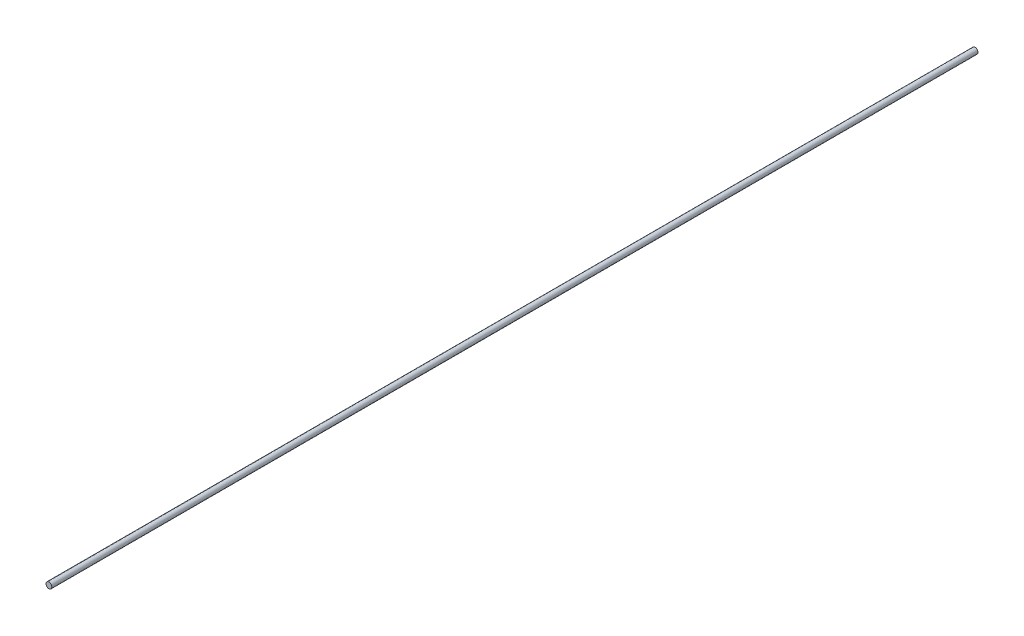
ISO-10303-21;
HEADER;
FILE_DESCRIPTION(('STEP AP214'),'2;1');
FILE_NAME('part.step','',(''),(''),'','','');
FILE_SCHEMA(('AUTOMOTIVE_DESIGN { 1 0 10303 214 1 1 1 1 }'));
ENDSEC;
DATA;
#1=APPLICATION_CONTEXT('core data for automotive mechanical design processes');
#2=APPLICATION_PROTOCOL_DEFINITION('international standard','automotive_design',2000,#1);
#3=PRODUCT_CONTEXT('',#1,'mechanical');
#4=PRODUCT('Part','Part','',(#3));
#5=PRODUCT_RELATED_PRODUCT_CATEGORY('part','',(#4));
#6=PRODUCT_DEFINITION_FORMATION('','',#4);
#7=PRODUCT_DEFINITION_CONTEXT('part definition',#1,'design');
#8=PRODUCT_DEFINITION('design','',#6,#7);
#9=PRODUCT_DEFINITION_SHAPE('','',#8);
#10=(LENGTH_UNIT() NAMED_UNIT(*) SI_UNIT(.MILLI.,.METRE.));
#11=(NAMED_UNIT(*) PLANE_ANGLE_UNIT() SI_UNIT($,.RADIAN.));
#12=(NAMED_UNIT(*) SI_UNIT($,.STERADIAN.) SOLID_ANGLE_UNIT());
#13=UNCERTAINTY_MEASURE_WITH_UNIT(LENGTH_MEASURE(1.E-05),#10,'distance_accuracy_value','');
#14=(GEOMETRIC_REPRESENTATION_CONTEXT(3) GLOBAL_UNCERTAINTY_ASSIGNED_CONTEXT((#13)) GLOBAL_UNIT_ASSIGNED_CONTEXT((#10,
#11,#12)) REPRESENTATION_CONTEXT('',''));
#15=CARTESIAN_POINT('',(0.,0.,0.));
#16=DIRECTION('',(0.,0.,1.));
#17=DIRECTION('',(1.,0.,0.));
#18=AXIS2_PLACEMENT_3D('',#15,#16,#17);
#19=CARTESIAN_POINT('',(0.,0.,1010.));
#20=DIRECTION('',(0.,0.,-1.));
#21=DIRECTION('',(-1.,0.,0.));
#22=AXIS2_PLACEMENT_3D('',#19,#20,#21);
#23=CYLINDRICAL_SURFACE('',#22,3.175);
#24=CARTESIAN_POINT('',(0.,0.,1010.));
#25=DIRECTION('',(0.,0.,1.));
#26=DIRECTION('',(1.,0.,0.));
#27=AXIS2_PLACEMENT_3D('',#24,#25,#26);
#28=CIRCLE('',#27,3.175);
#29=CARTESIAN_POINT('',(3.175,0.,1010.));
#30=VERTEX_POINT('',#29);
#31=EDGE_CURVE('E10',#30,#30,#28,.T.);
#32=ORIENTED_EDGE('',*,*,#31,.F.);
#33=EDGE_LOOP('',(#32));
#34=FACE_BOUND('',#33,.T.);
#35=CARTESIAN_POINT('',(0.,0.,0.));
#36=DIRECTION('',(0.,0.,1.));
#37=DIRECTION('',(1.,0.,0.));
#38=AXIS2_PLACEMENT_3D('',#35,#36,#37);
#39=CIRCLE('',#38,3.175);
#40=CARTESIAN_POINT('',(3.175,0.,0.));
#41=VERTEX_POINT('',#40);
#42=EDGE_CURVE('E17',#41,#41,#39,.T.);
#43=ORIENTED_EDGE('',*,*,#42,.T.);
#44=EDGE_LOOP('',(#43));
#45=FACE_BOUND('',#44,.T.);
#46=ADVANCED_FACE('F14',(#34,#45),#23,.T.);
#47=CARTESIAN_POINT('',(0.,0.,1010.));
#48=DIRECTION('',(0.,0.,1.));
#49=DIRECTION('',(1.,0.,0.));
#50=AXIS2_PLACEMENT_3D('',#47,#48,#49);
#51=PLANE('',#50);
#52=ORIENTED_EDGE('',*,*,#31,.T.);
#53=EDGE_LOOP('',(#52));
#54=FACE_BOUND('',#53,.T.);
#55=ADVANCED_FACE('F29',(#54),#51,.T.);
#56=CARTESIAN_POINT('',(0.,0.,0.));
#57=DIRECTION('',(0.,0.,1.));
#58=DIRECTION('',(1.,0.,0.));
#59=AXIS2_PLACEMENT_3D('',#56,#57,#58);
#60=PLANE('',#59);
#61=ORIENTED_EDGE('',*,*,#42,.F.);
#62=EDGE_LOOP('',(#61));
#63=FACE_BOUND('',#62,.T.);
#64=ADVANCED_FACE('F27',(#63),#60,.F.);
#65=CLOSED_SHELL('',(#46,#55,#64));
#66=MANIFOLD_SOLID_BREP('B1',#65);
#67=ADVANCED_BREP_SHAPE_REPRESENTATION('',(#18,#66),#14);
#68=SHAPE_DEFINITION_REPRESENTATION(#9,#67);
ENDSEC;
END-ISO-10303-21;
